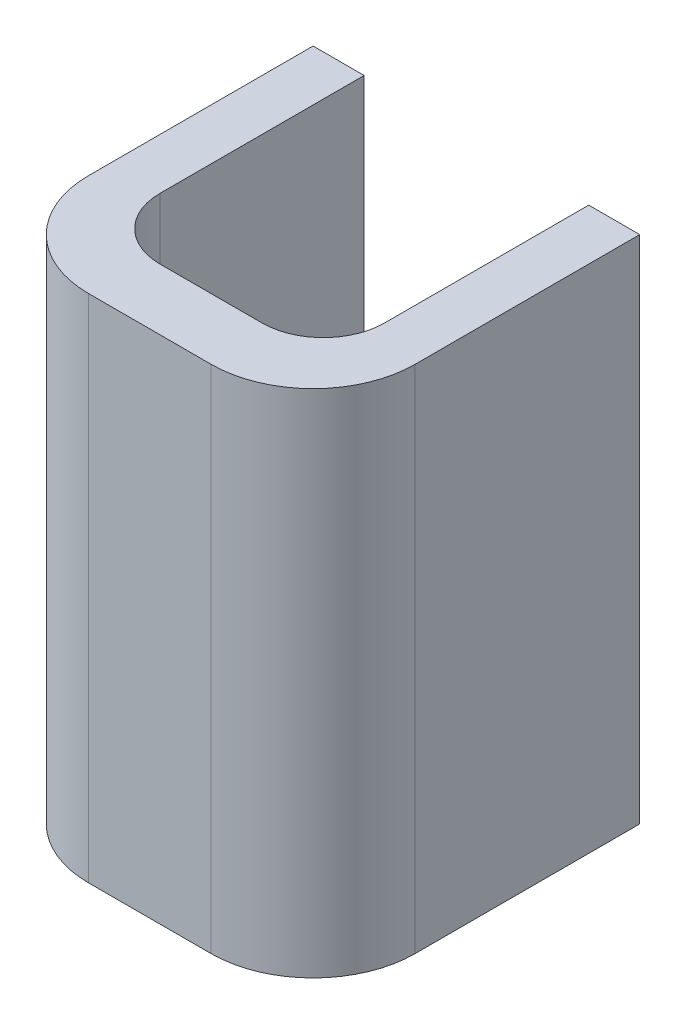
ISO-10303-21;
HEADER;
FILE_DESCRIPTION(('STEP AP214'),'2;1');
FILE_NAME('part.step','',(''),(''),'','','');
FILE_SCHEMA(('AUTOMOTIVE_DESIGN { 1 0 10303 214 1 1 1 1 }'));
ENDSEC;
DATA;
#1=APPLICATION_CONTEXT('core data for automotive mechanical design processes');
#2=APPLICATION_PROTOCOL_DEFINITION('international standard','automotive_design',2000,#1);
#3=PRODUCT_CONTEXT('',#1,'mechanical');
#4=PRODUCT('Part','Part','',(#3));
#5=PRODUCT_RELATED_PRODUCT_CATEGORY('part','',(#4));
#6=PRODUCT_DEFINITION_FORMATION('','',#4);
#7=PRODUCT_DEFINITION_CONTEXT('part definition',#1,'design');
#8=PRODUCT_DEFINITION('design','',#6,#7);
#9=PRODUCT_DEFINITION_SHAPE('','',#8);
#10=(LENGTH_UNIT() NAMED_UNIT(*) SI_UNIT(.MILLI.,.METRE.));
#11=(NAMED_UNIT(*) PLANE_ANGLE_UNIT() SI_UNIT($,.RADIAN.));
#12=(NAMED_UNIT(*) SI_UNIT($,.STERADIAN.) SOLID_ANGLE_UNIT());
#13=UNCERTAINTY_MEASURE_WITH_UNIT(LENGTH_MEASURE(1.E-05),#10,'distance_accuracy_value','');
#14=(GEOMETRIC_REPRESENTATION_CONTEXT(3) GLOBAL_UNCERTAINTY_ASSIGNED_CONTEXT((#13)) GLOBAL_UNIT_ASSIGNED_CONTEXT((#10,
#11,#12)) REPRESENTATION_CONTEXT('',''));
#15=CARTESIAN_POINT('',(0.,0.,0.));
#16=DIRECTION('',(0.,0.,1.));
#17=DIRECTION('',(1.,0.,0.));
#18=AXIS2_PLACEMENT_3D('',#15,#16,#17);
#19=CARTESIAN_POINT('',(5.5,25.,0.));
#20=DIRECTION('',(-1.,0.,0.));
#21=DIRECTION('',(0.,0.,1.));
#22=AXIS2_PLACEMENT_3D('',#19,#20,#21);
#23=PLANE('',#22);
#24=DIRECTION('',(0.,0.,-1.));
#25=VECTOR('',#24,1.);
#26=CARTESIAN_POINT('',(5.5,0.,0.));
#27=LINE('',#26,#25);
#28=CARTESIAN_POINT('',(5.5,0.,-4.5));
#29=VERTEX_POINT('',#28);
#30=CARTESIAN_POINT('',(5.5,0.,-14.5));
#31=VERTEX_POINT('',#30);
#32=EDGE_CURVE('E165',#29,#31,#27,.T.);
#33=ORIENTED_EDGE('',*,*,#32,.F.);
#34=DIRECTION('',(0.,-1.,0.));
#35=VECTOR('',#34,1.);
#36=CARTESIAN_POINT('',(5.5,25.,-4.5));
#37=LINE('',#36,#35);
#38=CARTESIAN_POINT('',(5.5,25.,-4.5));
#39=VERTEX_POINT('',#38);
#40=EDGE_CURVE('E195',#29,#39,#37,.F.);
#41=ORIENTED_EDGE('',*,*,#40,.T.);
#42=DIRECTION('',(0.,0.,-1.));
#43=VECTOR('',#42,1.);
#44=CARTESIAN_POINT('',(5.5,25.,0.));
#45=LINE('',#44,#43);
#46=CARTESIAN_POINT('',(5.5,25.,-14.5));
#47=VERTEX_POINT('',#46);
#48=EDGE_CURVE('E182',#39,#47,#45,.T.);
#49=ORIENTED_EDGE('',*,*,#48,.T.);
#50=DIRECTION('',(0.,-1.,0.));
#51=VECTOR('',#50,1.);
#52=CARTESIAN_POINT('',(5.5,25.,-14.5));
#53=LINE('',#52,#51);
#54=EDGE_CURVE('E164',#47,#31,#53,.T.);
#55=ORIENTED_EDGE('',*,*,#54,.T.);
#56=EDGE_LOOP('',(#33,#41,#49,#55));
#57=FACE_BOUND('',#56,.T.);
#58=ADVANCED_FACE('F35',(#57),#23,.T.);
#59=CARTESIAN_POINT('',(0.,25.,-1.5));
#60=DIRECTION('',(0.,0.,-1.));
#61=DIRECTION('',(-1.,0.,0.));
#62=AXIS2_PLACEMENT_3D('',#59,#60,#61);
#63=PLANE('',#62);
#64=DIRECTION('',(1.,0.,0.));
#65=VECTOR('',#64,1.);
#66=CARTESIAN_POINT('',(0.,0.,-1.5));
#67=LINE('',#66,#65);
#68=CARTESIAN_POINT('',(-2.5,0.,-1.5));
#69=VERTEX_POINT('',#68);
#70=CARTESIAN_POINT('',(2.5,0.,-1.5));
#71=VERTEX_POINT('',#70);
#72=EDGE_CURVE('E167',#69,#71,#67,.T.);
#73=ORIENTED_EDGE('',*,*,#72,.F.);
#74=DIRECTION('',(0.,-1.,0.));
#75=VECTOR('',#74,1.);
#76=CARTESIAN_POINT('',(-2.5,25.,-1.5));
#77=LINE('',#76,#75);
#78=CARTESIAN_POINT('',(-2.5,25.,-1.5));
#79=VERTEX_POINT('',#78);
#80=EDGE_CURVE('E193',#69,#79,#77,.F.);
#81=ORIENTED_EDGE('',*,*,#80,.T.);
#82=DIRECTION('',(1.,0.,0.));
#83=VECTOR('',#82,1.);
#84=CARTESIAN_POINT('',(0.,25.,-1.5));
#85=LINE('',#84,#83);
#86=CARTESIAN_POINT('',(2.5,25.,-1.5));
#87=VERTEX_POINT('',#86);
#88=EDGE_CURVE('E136',#79,#87,#85,.T.);
#89=ORIENTED_EDGE('',*,*,#88,.T.);
#90=DIRECTION('',(0.,-1.,0.));
#91=VECTOR('',#90,1.);
#92=CARTESIAN_POINT('',(2.5,0.,-1.5));
#93=LINE('',#92,#91);
#94=EDGE_CURVE('E190',#87,#71,#93,.T.);
#95=ORIENTED_EDGE('',*,*,#94,.T.);
#96=EDGE_LOOP('',(#73,#81,#89,#95));
#97=FACE_BOUND('',#96,.T.);
#98=ADVANCED_FACE('F239',(#97),#63,.T.);
#99=CARTESIAN_POINT('',(-5.5,25.,0.));
#100=DIRECTION('',(-1.,0.,0.));
#101=DIRECTION('',(0.,0.,1.));
#102=AXIS2_PLACEMENT_3D('',#99,#100,#101);
#103=PLANE('',#102);
#104=DIRECTION('',(0.,0.,-1.));
#105=VECTOR('',#104,1.);
#106=CARTESIAN_POINT('',(-5.5,25.,0.));
#107=LINE('',#106,#105);
#108=CARTESIAN_POINT('',(-5.5,25.,-4.5));
#109=VERTEX_POINT('',#108);
#110=CARTESIAN_POINT('',(-5.5,25.,-14.5));
#111=VERTEX_POINT('',#110);
#112=EDGE_CURVE('E125',#109,#111,#107,.T.);
#113=ORIENTED_EDGE('',*,*,#112,.F.);
#114=DIRECTION('',(0.,-1.,0.));
#115=VECTOR('',#114,1.);
#116=CARTESIAN_POINT('',(-5.5,25.,-4.5));
#117=LINE('',#116,#115);
#118=CARTESIAN_POINT('',(-5.5,0.,-4.5));
#119=VERTEX_POINT('',#118);
#120=EDGE_CURVE('E146',#109,#119,#117,.T.);
#121=ORIENTED_EDGE('',*,*,#120,.T.);
#122=DIRECTION('',(0.,0.,-1.));
#123=VECTOR('',#122,1.);
#124=CARTESIAN_POINT('',(-5.5,0.,0.));
#125=LINE('',#124,#123);
#126=CARTESIAN_POINT('',(-5.5,0.,-14.5));
#127=VERTEX_POINT('',#126);
#128=EDGE_CURVE('E142',#119,#127,#125,.T.);
#129=ORIENTED_EDGE('',*,*,#128,.T.);
#130=DIRECTION('',(0.,-1.,0.));
#131=VECTOR('',#130,1.);
#132=CARTESIAN_POINT('',(-5.5,25.,-14.5));
#133=LINE('',#132,#131);
#134=EDGE_CURVE('E139',#111,#127,#133,.T.);
#135=ORIENTED_EDGE('',*,*,#134,.F.);
#136=EDGE_LOOP('',(#113,#121,#129,#135));
#137=FACE_BOUND('',#136,.T.);
#138=ADVANCED_FACE('F140',(#137),#103,.F.);
#139=CARTESIAN_POINT('',(0.,25.,-14.5));
#140=DIRECTION('',(0.,0.,-1.));
#141=DIRECTION('',(-1.,0.,0.));
#142=AXIS2_PLACEMENT_3D('',#139,#140,#141);
#143=PLANE('',#142);
#144=DIRECTION('',(1.,0.,0.));
#145=VECTOR('',#144,1.);
#146=CARTESIAN_POINT('',(0.,0.,-14.5));
#147=LINE('',#146,#145);
#148=CARTESIAN_POINT('',(-8.,0.,-14.5));
#149=VERTEX_POINT('',#148);
#150=EDGE_CURVE('E171',#149,#127,#147,.T.);
#151=ORIENTED_EDGE('',*,*,#150,.F.);
#152=DIRECTION('',(0.,-1.,0.));
#153=VECTOR('',#152,1.);
#154=CARTESIAN_POINT('',(-8.,25.,-14.5));
#155=LINE('',#154,#153);
#156=CARTESIAN_POINT('',(-8.,25.,-14.5));
#157=VERTEX_POINT('',#156);
#158=EDGE_CURVE('E147',#157,#149,#155,.T.);
#159=ORIENTED_EDGE('',*,*,#158,.F.);
#160=DIRECTION('',(1.,0.,0.));
#161=VECTOR('',#160,1.);
#162=CARTESIAN_POINT('',(0.,25.,-14.5));
#163=LINE('',#162,#161);
#164=EDGE_CURVE('E129',#157,#111,#163,.T.);
#165=ORIENTED_EDGE('',*,*,#164,.T.);
#166=ORIENTED_EDGE('',*,*,#134,.T.);
#167=EDGE_LOOP('',(#151,#159,#165,#166));
#168=FACE_BOUND('',#167,.T.);
#169=ADVANCED_FACE('F150',(#168),#143,.T.);
#170=CARTESIAN_POINT('',(-8.,25.,0.));
#171=DIRECTION('',(-1.,0.,0.));
#172=DIRECTION('',(0.,0.,1.));
#173=AXIS2_PLACEMENT_3D('',#170,#171,#172);
#174=PLANE('',#173);
#175=DIRECTION('',(0.,0.,-1.));
#176=VECTOR('',#175,1.);
#177=CARTESIAN_POINT('',(-8.,0.,0.));
#178=LINE('',#177,#176);
#179=CARTESIAN_POINT('',(-8.,0.,-3.5));
#180=VERTEX_POINT('',#179);
#181=EDGE_CURVE('E173',#180,#149,#178,.T.);
#182=ORIENTED_EDGE('',*,*,#181,.F.);
#183=DIRECTION('',(0.,-1.,0.));
#184=VECTOR('',#183,1.);
#185=CARTESIAN_POINT('',(-8.,25.,-3.5));
#186=LINE('',#185,#184);
#187=CARTESIAN_POINT('',(-8.,25.,-3.5));
#188=VERTEX_POINT('',#187);
#189=EDGE_CURVE('E11',#180,#188,#186,.F.);
#190=ORIENTED_EDGE('',*,*,#189,.T.);
#191=DIRECTION('',(0.,0.,-1.));
#192=VECTOR('',#191,1.);
#193=CARTESIAN_POINT('',(-8.,25.,0.));
#194=LINE('',#193,#192);
#195=EDGE_CURVE('E152',#188,#157,#194,.T.);
#196=ORIENTED_EDGE('',*,*,#195,.T.);
#197=ORIENTED_EDGE('',*,*,#158,.T.);
#198=EDGE_LOOP('',(#182,#190,#196,#197));
#199=FACE_BOUND('',#198,.T.);
#200=ADVANCED_FACE('F234',(#199),#174,.T.);
#201=CARTESIAN_POINT('',(0.,25.,1.5));
#202=DIRECTION('',(0.,0.,-1.));
#203=DIRECTION('',(-1.,0.,0.));
#204=AXIS2_PLACEMENT_3D('',#201,#202,#203);
#205=PLANE('',#204);
#206=DIRECTION('',(1.,0.,0.));
#207=VECTOR('',#206,1.);
#208=CARTESIAN_POINT('',(0.,0.,1.5));
#209=LINE('',#208,#207);
#210=CARTESIAN_POINT('',(-3.,0.,1.5));
#211=VERTEX_POINT('',#210);
#212=CARTESIAN_POINT('',(3.,0.,1.5));
#213=VERTEX_POINT('',#212);
#214=EDGE_CURVE('E175',#211,#213,#209,.T.);
#215=ORIENTED_EDGE('',*,*,#214,.T.);
#216=DIRECTION('',(0.,-1.,0.));
#217=VECTOR('',#216,1.);
#218=CARTESIAN_POINT('',(3.,25.,1.5));
#219=LINE('',#218,#217);
#220=CARTESIAN_POINT('',(3.,25.,1.5));
#221=VERTEX_POINT('',#220);
#222=EDGE_CURVE('E56',#213,#221,#219,.F.);
#223=ORIENTED_EDGE('',*,*,#222,.T.);
#224=DIRECTION('',(1.,0.,0.));
#225=VECTOR('',#224,1.);
#226=CARTESIAN_POINT('',(0.,25.,1.5));
#227=LINE('',#226,#225);
#228=CARTESIAN_POINT('',(-3.,25.,1.5));
#229=VERTEX_POINT('',#228);
#230=EDGE_CURVE('E154',#229,#221,#227,.T.);
#231=ORIENTED_EDGE('',*,*,#230,.F.);
#232=DIRECTION('',(0.,-1.,0.));
#233=VECTOR('',#232,1.);
#234=CARTESIAN_POINT('',(-3.,0.,1.5));
#235=LINE('',#234,#233);
#236=EDGE_CURVE('E211',#229,#211,#235,.T.);
#237=ORIENTED_EDGE('',*,*,#236,.T.);
#238=EDGE_LOOP('',(#215,#223,#231,#237));
#239=FACE_BOUND('',#238,.T.);
#240=ADVANCED_FACE('F230',(#239),#205,.F.);
#241=CARTESIAN_POINT('',(8.,25.,0.));
#242=DIRECTION('',(-1.,0.,0.));
#243=DIRECTION('',(0.,0.,1.));
#244=AXIS2_PLACEMENT_3D('',#241,#242,#243);
#245=PLANE('',#244);
#246=DIRECTION('',(0.,0.,-1.));
#247=VECTOR('',#246,1.);
#248=CARTESIAN_POINT('',(8.,25.,0.));
#249=LINE('',#248,#247);
#250=CARTESIAN_POINT('',(8.,25.,-3.5));
#251=VERTEX_POINT('',#250);
#252=CARTESIAN_POINT('',(8.,25.,-14.5));
#253=VERTEX_POINT('',#252);
#254=EDGE_CURVE('E159',#251,#253,#249,.T.);
#255=ORIENTED_EDGE('',*,*,#254,.F.);
#256=DIRECTION('',(0.,-1.,0.));
#257=VECTOR('',#256,1.);
#258=CARTESIAN_POINT('',(8.,25.,-3.5));
#259=LINE('',#258,#257);
#260=CARTESIAN_POINT('',(8.,0.,-3.5));
#261=VERTEX_POINT('',#260);
#262=EDGE_CURVE('E204',#251,#261,#259,.T.);
#263=ORIENTED_EDGE('',*,*,#262,.T.);
#264=DIRECTION('',(0.,0.,-1.));
#265=VECTOR('',#264,1.);
#266=CARTESIAN_POINT('',(8.,0.,0.));
#267=LINE('',#266,#265);
#268=CARTESIAN_POINT('',(8.,0.,-14.5));
#269=VERTEX_POINT('',#268);
#270=EDGE_CURVE('E177',#261,#269,#267,.T.);
#271=ORIENTED_EDGE('',*,*,#270,.T.);
#272=DIRECTION('',(0.,-1.,0.));
#273=VECTOR('',#272,1.);
#274=CARTESIAN_POINT('',(8.,25.,-14.5));
#275=LINE('',#274,#273);
#276=EDGE_CURVE('E185',#253,#269,#275,.T.);
#277=ORIENTED_EDGE('',*,*,#276,.F.);
#278=EDGE_LOOP('',(#255,#263,#271,#277));
#279=FACE_BOUND('',#278,.T.);
#280=ADVANCED_FACE('F222',(#279),#245,.F.);
#281=CARTESIAN_POINT('',(0.,25.,-14.5));
#282=DIRECTION('',(0.,0.,1.));
#283=DIRECTION('',(1.,0.,0.));
#284=AXIS2_PLACEMENT_3D('',#281,#282,#283);
#285=PLANE('',#284);
#286=DIRECTION('',(-1.,0.,0.));
#287=VECTOR('',#286,1.);
#288=CARTESIAN_POINT('',(0.,0.,-14.5));
#289=LINE('',#288,#287);
#290=EDGE_CURVE('E179',#269,#31,#289,.T.);
#291=ORIENTED_EDGE('',*,*,#290,.T.);
#292=ORIENTED_EDGE('',*,*,#54,.F.);
#293=DIRECTION('',(-1.,0.,0.));
#294=VECTOR('',#293,1.);
#295=CARTESIAN_POINT('',(0.,25.,-14.5));
#296=LINE('',#295,#294);
#297=EDGE_CURVE('E161',#253,#47,#296,.T.);
#298=ORIENTED_EDGE('',*,*,#297,.F.);
#299=ORIENTED_EDGE('',*,*,#276,.T.);
#300=EDGE_LOOP('',(#291,#292,#298,#299));
#301=FACE_BOUND('',#300,.T.);
#302=ADVANCED_FACE('F272',(#301),#285,.F.);
#303=CARTESIAN_POINT('',(0.,25.,0.));
#304=DIRECTION('',(0.,1.,0.));
#305=DIRECTION('',(0.,0.,1.));
#306=AXIS2_PLACEMENT_3D('',#303,#304,#305);
#307=PLANE('',#306);
#308=ORIENTED_EDGE('',*,*,#230,.T.);
#309=CARTESIAN_POINT('',(3.,25.,-3.5));
#310=DIRECTION('',(0.,1.,0.));
#311=DIRECTION('',(0.,0.,1.));
#312=AXIS2_PLACEMENT_3D('',#309,#310,#311);
#313=CIRCLE('',#312,5.);
#314=EDGE_CURVE('E43',#221,#251,#313,.T.);
#315=ORIENTED_EDGE('',*,*,#314,.T.);
#316=ORIENTED_EDGE('',*,*,#254,.T.);
#317=ORIENTED_EDGE('',*,*,#297,.T.);
#318=ORIENTED_EDGE('',*,*,#48,.F.);
#319=CARTESIAN_POINT('',(2.5,25.,-4.5));
#320=DIRECTION('',(0.,1.,0.));
#321=DIRECTION('',(0.,0.,1.));
#322=AXIS2_PLACEMENT_3D('',#319,#320,#321);
#323=CIRCLE('',#322,3.);
#324=EDGE_CURVE('E202',#39,#87,#323,.F.);
#325=ORIENTED_EDGE('',*,*,#324,.T.);
#326=ORIENTED_EDGE('',*,*,#88,.F.);
#327=CARTESIAN_POINT('',(-2.5,25.,-4.5));
#328=DIRECTION('',(0.,1.,0.));
#329=DIRECTION('',(0.,0.,1.));
#330=AXIS2_PLACEMENT_3D('',#327,#328,#329);
#331=CIRCLE('',#330,3.);
#332=EDGE_CURVE('E132',#79,#109,#331,.F.);
#333=ORIENTED_EDGE('',*,*,#332,.T.);
#334=ORIENTED_EDGE('',*,*,#112,.T.);
#335=ORIENTED_EDGE('',*,*,#164,.F.);
#336=ORIENTED_EDGE('',*,*,#195,.F.);
#337=CARTESIAN_POINT('',(-3.,25.,-3.5));
#338=DIRECTION('',(0.,1.,0.));
#339=DIRECTION('',(0.,0.,1.));
#340=AXIS2_PLACEMENT_3D('',#337,#338,#339);
#341=CIRCLE('',#340,5.);
#342=EDGE_CURVE('E215',#188,#229,#341,.T.);
#343=ORIENTED_EDGE('',*,*,#342,.T.);
#344=EDGE_LOOP('',(#308,#315,#316,#317,#318,#325,#326,#333,#334,#335,#336,#343));
#345=FACE_BOUND('',#344,.T.);
#346=ADVANCED_FACE('F127',(#345),#307,.T.);
#347=CARTESIAN_POINT('',(0.,0.,0.));
#348=DIRECTION('',(0.,1.,0.));
#349=DIRECTION('',(0.,0.,1.));
#350=AXIS2_PLACEMENT_3D('',#347,#348,#349);
#351=PLANE('',#350);
#352=ORIENTED_EDGE('',*,*,#270,.F.);
#353=CARTESIAN_POINT('',(3.,0.,-3.5));
#354=DIRECTION('',(0.,1.,0.));
#355=DIRECTION('',(0.,0.,1.));
#356=AXIS2_PLACEMENT_3D('',#353,#354,#355);
#357=CIRCLE('',#356,5.);
#358=EDGE_CURVE('E209',#261,#213,#357,.F.);
#359=ORIENTED_EDGE('',*,*,#358,.T.);
#360=ORIENTED_EDGE('',*,*,#214,.F.);
#361=CARTESIAN_POINT('',(-3.,0.,-3.5));
#362=DIRECTION('',(0.,1.,0.));
#363=DIRECTION('',(0.,0.,1.));
#364=AXIS2_PLACEMENT_3D('',#361,#362,#363);
#365=CIRCLE('',#364,5.);
#366=EDGE_CURVE('E207',#211,#180,#365,.F.);
#367=ORIENTED_EDGE('',*,*,#366,.T.);
#368=ORIENTED_EDGE('',*,*,#181,.T.);
#369=ORIENTED_EDGE('',*,*,#150,.T.);
#370=ORIENTED_EDGE('',*,*,#128,.F.);
#371=CARTESIAN_POINT('',(-2.5,0.,-4.5));
#372=DIRECTION('',(0.,1.,0.));
#373=DIRECTION('',(0.,0.,1.));
#374=AXIS2_PLACEMENT_3D('',#371,#372,#373);
#375=CIRCLE('',#374,3.);
#376=EDGE_CURVE('E197',#119,#69,#375,.T.);
#377=ORIENTED_EDGE('',*,*,#376,.T.);
#378=ORIENTED_EDGE('',*,*,#72,.T.);
#379=CARTESIAN_POINT('',(2.5,0.,-4.5));
#380=DIRECTION('',(0.,1.,0.));
#381=DIRECTION('',(0.,0.,1.));
#382=AXIS2_PLACEMENT_3D('',#379,#380,#381);
#383=CIRCLE('',#382,3.);
#384=EDGE_CURVE('E200',#71,#29,#383,.T.);
#385=ORIENTED_EDGE('',*,*,#384,.T.);
#386=ORIENTED_EDGE('',*,*,#32,.T.);
#387=ORIENTED_EDGE('',*,*,#290,.F.);
#388=EDGE_LOOP('',(#352,#359,#360,#367,#368,#369,#370,#377,#378,#385,#386,#387));
#389=FACE_BOUND('',#388,.T.);
#390=ADVANCED_FACE('F228',(#389),#351,.F.);
#391=CARTESIAN_POINT('',(-2.5,25.,-4.5));
#392=DIRECTION('',(0.,-1.,0.));
#393=DIRECTION('',(0.,0.,-1.));
#394=AXIS2_PLACEMENT_3D('',#391,#392,#393);
#395=CYLINDRICAL_SURFACE('',#394,3.);
#396=ORIENTED_EDGE('',*,*,#332,.F.);
#397=ORIENTED_EDGE('',*,*,#80,.F.);
#398=ORIENTED_EDGE('',*,*,#376,.F.);
#399=ORIENTED_EDGE('',*,*,#120,.F.);
#400=EDGE_LOOP('',(#396,#397,#398,#399));
#401=FACE_BOUND('',#400,.T.);
#402=ADVANCED_FACE('F242',(#401),#395,.F.);
#403=CARTESIAN_POINT('',(2.5,25.,-4.5));
#404=DIRECTION('',(0.,1.,0.));
#405=DIRECTION('',(0.,0.,1.));
#406=AXIS2_PLACEMENT_3D('',#403,#404,#405);
#407=CYLINDRICAL_SURFACE('',#406,3.);
#408=ORIENTED_EDGE('',*,*,#324,.F.);
#409=ORIENTED_EDGE('',*,*,#40,.F.);
#410=ORIENTED_EDGE('',*,*,#384,.F.);
#411=ORIENTED_EDGE('',*,*,#94,.F.);
#412=EDGE_LOOP('',(#408,#409,#410,#411));
#413=FACE_BOUND('',#412,.T.);
#414=ADVANCED_FACE('F244',(#413),#407,.F.);
#415=CARTESIAN_POINT('',(3.,25.,-3.5));
#416=DIRECTION('',(0.,-1.,0.));
#417=DIRECTION('',(0.,0.,-1.));
#418=AXIS2_PLACEMENT_3D('',#415,#416,#417);
#419=CYLINDRICAL_SURFACE('',#418,5.);
#420=ORIENTED_EDGE('',*,*,#314,.F.);
#421=ORIENTED_EDGE('',*,*,#222,.F.);
#422=ORIENTED_EDGE('',*,*,#358,.F.);
#423=ORIENTED_EDGE('',*,*,#262,.F.);
#424=EDGE_LOOP('',(#420,#421,#422,#423));
#425=FACE_BOUND('',#424,.T.);
#426=ADVANCED_FACE('F225',(#425),#419,.T.);
#427=CARTESIAN_POINT('',(-3.,25.,-3.5));
#428=DIRECTION('',(0.,1.,0.));
#429=DIRECTION('',(0.,0.,1.));
#430=AXIS2_PLACEMENT_3D('',#427,#428,#429);
#431=CYLINDRICAL_SURFACE('',#430,5.);
#432=ORIENTED_EDGE('',*,*,#342,.F.);
#433=ORIENTED_EDGE('',*,*,#189,.F.);
#434=ORIENTED_EDGE('',*,*,#366,.F.);
#435=ORIENTED_EDGE('',*,*,#236,.F.);
#436=EDGE_LOOP('',(#432,#433,#434,#435));
#437=FACE_BOUND('',#436,.T.);
#438=ADVANCED_FACE('F37',(#437),#431,.T.);
#439=CLOSED_SHELL('',(#58,#98,#138,#169,#200,#240,#280,#302,#346,#390,#402,#414,#426,#438));
#440=MANIFOLD_SOLID_BREP('B2',#439);
#441=ADVANCED_BREP_SHAPE_REPRESENTATION('',(#18,#440),#14);
#442=SHAPE_DEFINITION_REPRESENTATION(#9,#441);
ENDSEC;
END-ISO-10303-21;
